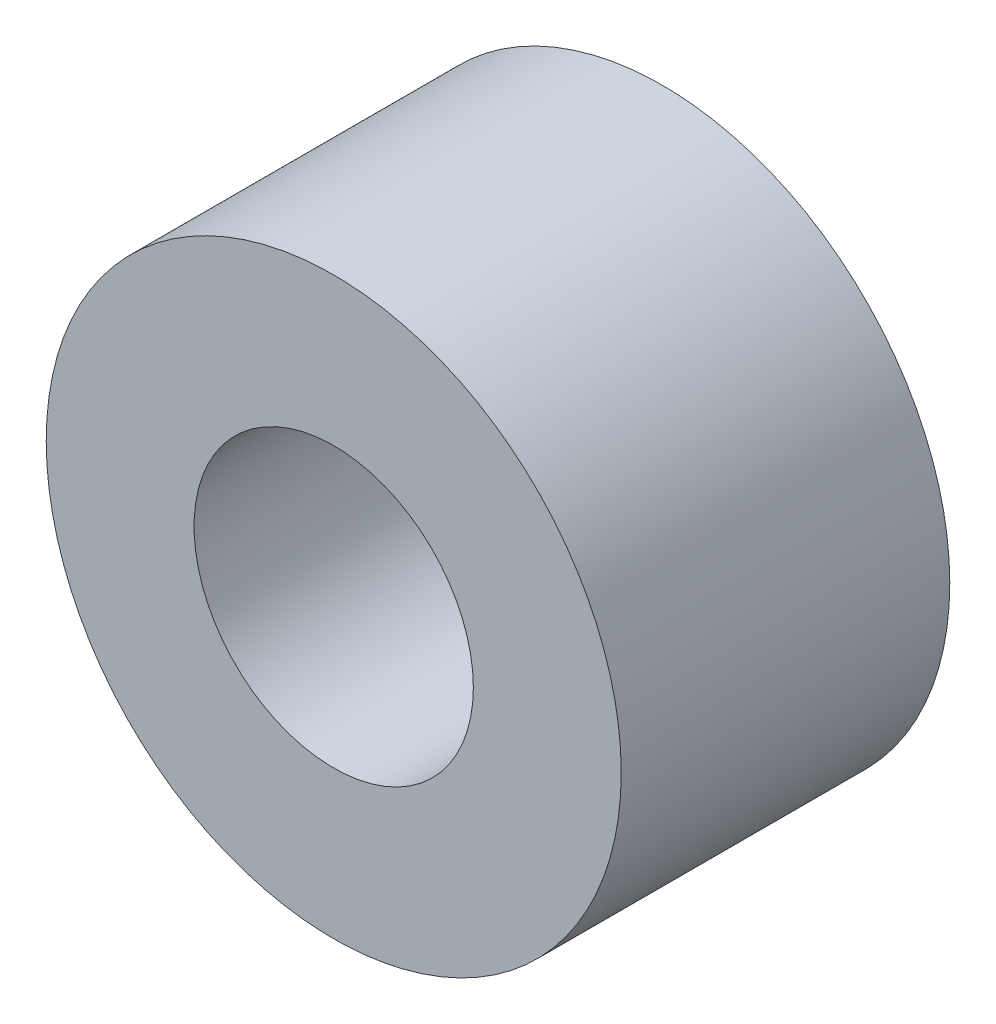
ISO-10303-21;
HEADER;
FILE_DESCRIPTION(('STEP AP214'),'2;1');
FILE_NAME('part.step','',(''),(''),'','','');
FILE_SCHEMA(('AUTOMOTIVE_DESIGN { 1 0 10303 214 1 1 1 1 }'));
ENDSEC;
DATA;
#1=APPLICATION_CONTEXT('core data for automotive mechanical design processes');
#2=APPLICATION_PROTOCOL_DEFINITION('international standard','automotive_design',2000,#1);
#3=PRODUCT_CONTEXT('',#1,'mechanical');
#4=PRODUCT('Part','Part','',(#3));
#5=PRODUCT_RELATED_PRODUCT_CATEGORY('part','',(#4));
#6=PRODUCT_DEFINITION_FORMATION('','',#4);
#7=PRODUCT_DEFINITION_CONTEXT('part definition',#1,'design');
#8=PRODUCT_DEFINITION('design','',#6,#7);
#9=PRODUCT_DEFINITION_SHAPE('','',#8);
#10=(LENGTH_UNIT() NAMED_UNIT(*) SI_UNIT(.MILLI.,.METRE.));
#11=(NAMED_UNIT(*) PLANE_ANGLE_UNIT() SI_UNIT($,.RADIAN.));
#12=(NAMED_UNIT(*) SI_UNIT($,.STERADIAN.) SOLID_ANGLE_UNIT());
#13=UNCERTAINTY_MEASURE_WITH_UNIT(LENGTH_MEASURE(1.E-05),#10,'distance_accuracy_value','');
#14=(GEOMETRIC_REPRESENTATION_CONTEXT(3) GLOBAL_UNCERTAINTY_ASSIGNED_CONTEXT((#13)) GLOBAL_UNIT_ASSIGNED_CONTEXT((#10,
#11,#12)) REPRESENTATION_CONTEXT('',''));
#15=CARTESIAN_POINT('',(0.,0.,0.));
#16=DIRECTION('',(0.,0.,1.));
#17=DIRECTION('',(1.,0.,0.));
#18=AXIS2_PLACEMENT_3D('',#15,#16,#17);
#19=CARTESIAN_POINT('',(0.,0.,4.));
#20=DIRECTION('',(0.,0.,1.));
#21=DIRECTION('',(1.,0.,0.));
#22=AXIS2_PLACEMENT_3D('',#19,#20,#21);
#23=PLANE('',#22);
#24=CARTESIAN_POINT('',(0.,0.,4.));
#25=DIRECTION('',(0.,0.,1.));
#26=DIRECTION('',(1.,0.,0.));
#27=AXIS2_PLACEMENT_3D('',#24,#25,#26);
#28=CIRCLE('',#27,3.5);
#29=CARTESIAN_POINT('',(3.5,0.,4.));
#30=VERTEX_POINT('',#29);
#31=EDGE_CURVE('E10',#30,#30,#28,.T.);
#32=ORIENTED_EDGE('',*,*,#31,.T.);
#33=EDGE_LOOP('',(#32));
#34=FACE_BOUND('',#33,.T.);
#35=CARTESIAN_POINT('',(0.,0.,4.));
#36=DIRECTION('',(0.,0.,1.));
#37=DIRECTION('',(1.,0.,0.));
#38=AXIS2_PLACEMENT_3D('',#35,#36,#37);
#39=CIRCLE('',#38,1.7);
#40=CARTESIAN_POINT('',(1.7,0.,4.));
#41=VERTEX_POINT('',#40);
#42=EDGE_CURVE('E57',#41,#41,#39,.T.);
#43=ORIENTED_EDGE('',*,*,#42,.F.);
#44=EDGE_LOOP('',(#43));
#45=FACE_BOUND('',#44,.T.);
#46=ADVANCED_FACE('F43',(#34,#45),#23,.T.);
#47=CARTESIAN_POINT('',(0.,0.,0.));
#48=DIRECTION('',(0.,0.,1.));
#49=DIRECTION('',(1.,0.,0.));
#50=AXIS2_PLACEMENT_3D('',#47,#48,#49);
#51=PLANE('',#50);
#52=CARTESIAN_POINT('',(0.,0.,0.));
#53=DIRECTION('',(0.,0.,1.));
#54=DIRECTION('',(1.,0.,0.));
#55=AXIS2_PLACEMENT_3D('',#52,#53,#54);
#56=CIRCLE('',#55,3.5);
#57=CARTESIAN_POINT('',(3.5,0.,0.));
#58=VERTEX_POINT('',#57);
#59=EDGE_CURVE('E47',#58,#58,#56,.T.);
#60=ORIENTED_EDGE('',*,*,#59,.F.);
#61=EDGE_LOOP('',(#60));
#62=FACE_BOUND('',#61,.T.);
#63=CARTESIAN_POINT('',(0.,0.,0.));
#64=DIRECTION('',(0.,0.,1.));
#65=DIRECTION('',(1.,0.,0.));
#66=AXIS2_PLACEMENT_3D('',#63,#64,#65);
#67=CIRCLE('',#66,1.7);
#68=CARTESIAN_POINT('',(1.7,0.,0.));
#69=VERTEX_POINT('',#68);
#70=EDGE_CURVE('E59',#69,#69,#67,.T.);
#71=ORIENTED_EDGE('',*,*,#70,.T.);
#72=EDGE_LOOP('',(#71));
#73=FACE_BOUND('',#72,.T.);
#74=ADVANCED_FACE('F70',(#62,#73),#51,.F.);
#75=CARTESIAN_POINT('',(0.,0.,4.));
#76=DIRECTION('',(0.,0.,-1.));
#77=DIRECTION('',(-1.,0.,0.));
#78=AXIS2_PLACEMENT_3D('',#75,#76,#77);
#79=CYLINDRICAL_SURFACE('',#78,3.5);
#80=ORIENTED_EDGE('',*,*,#31,.F.);
#81=EDGE_LOOP('',(#80));
#82=FACE_BOUND('',#81,.T.);
#83=ORIENTED_EDGE('',*,*,#59,.T.);
#84=EDGE_LOOP('',(#83));
#85=FACE_BOUND('',#84,.T.);
#86=ADVANCED_FACE('F45',(#82,#85),#79,.T.);
#87=CARTESIAN_POINT('',(0.,0.,4.));
#88=DIRECTION('',(0.,0.,-1.));
#89=DIRECTION('',(-1.,0.,0.));
#90=AXIS2_PLACEMENT_3D('',#87,#88,#89);
#91=CYLINDRICAL_SURFACE('',#90,1.7);
#92=ORIENTED_EDGE('',*,*,#42,.T.);
#93=EDGE_LOOP('',(#92));
#94=FACE_BOUND('',#93,.T.);
#95=ORIENTED_EDGE('',*,*,#70,.F.);
#96=EDGE_LOOP('',(#95));
#97=FACE_BOUND('',#96,.T.);
#98=ADVANCED_FACE('F66',(#94,#97),#91,.F.);
#99=CLOSED_SHELL('',(#46,#74,#86,#98));
#100=MANIFOLD_SOLID_BREP('B2',#99);
#101=ADVANCED_BREP_SHAPE_REPRESENTATION('',(#18,#100),#14);
#102=SHAPE_DEFINITION_REPRESENTATION(#9,#101);
ENDSEC;
END-ISO-10303-21;
